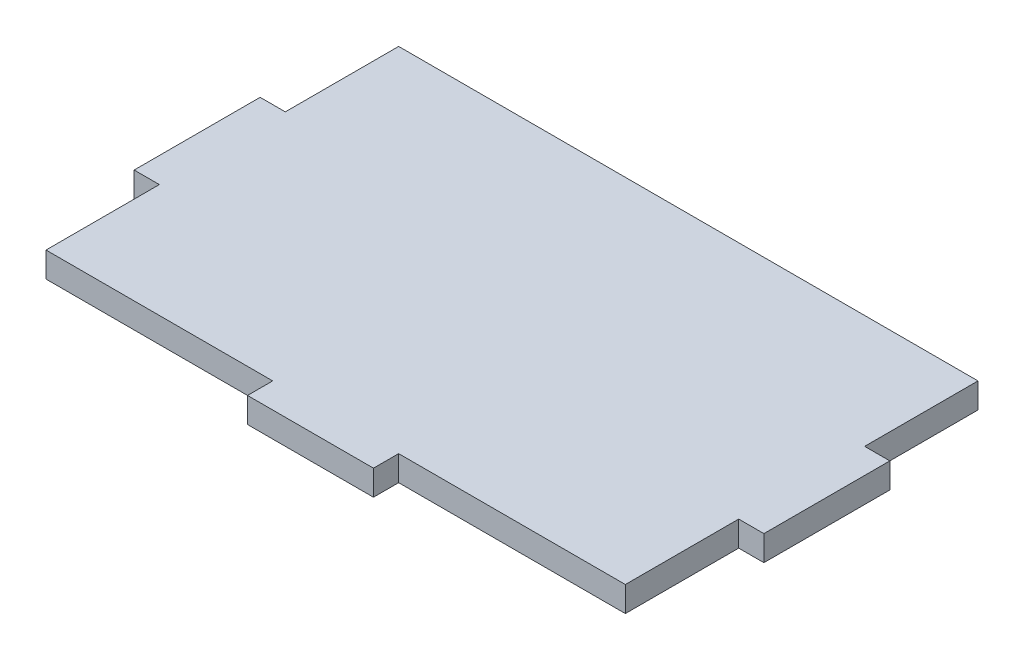
ISO-10303-21;
HEADER;
FILE_DESCRIPTION(('STEP AP214'),'2;1');
FILE_NAME('part.step','',(''),(''),'','','');
FILE_SCHEMA(('AUTOMOTIVE_DESIGN { 1 0 10303 214 1 1 1 1 }'));
ENDSEC;
DATA;
#1=APPLICATION_CONTEXT('core data for automotive mechanical design processes');
#2=APPLICATION_PROTOCOL_DEFINITION('international standard','automotive_design',2000,#1);
#3=PRODUCT_CONTEXT('',#1,'mechanical');
#4=PRODUCT('Part','Part','',(#3));
#5=PRODUCT_RELATED_PRODUCT_CATEGORY('part','',(#4));
#6=PRODUCT_DEFINITION_FORMATION('','',#4);
#7=PRODUCT_DEFINITION_CONTEXT('part definition',#1,'design');
#8=PRODUCT_DEFINITION('design','',#6,#7);
#9=PRODUCT_DEFINITION_SHAPE('','',#8);
#10=(LENGTH_UNIT() NAMED_UNIT(*) SI_UNIT(.MILLI.,.METRE.));
#11=(NAMED_UNIT(*) PLANE_ANGLE_UNIT() SI_UNIT($,.RADIAN.));
#12=(NAMED_UNIT(*) SI_UNIT($,.STERADIAN.) SOLID_ANGLE_UNIT());
#13=UNCERTAINTY_MEASURE_WITH_UNIT(LENGTH_MEASURE(1.E-05),#10,'distance_accuracy_value','');
#14=(GEOMETRIC_REPRESENTATION_CONTEXT(3) GLOBAL_UNCERTAINTY_ASSIGNED_CONTEXT((#13)) GLOBAL_UNIT_ASSIGNED_CONTEXT((#10,
#11,#12)) REPRESENTATION_CONTEXT('',''));
#15=CARTESIAN_POINT('',(0.,0.,0.));
#16=DIRECTION('',(0.,0.,1.));
#17=DIRECTION('',(1.,0.,0.));
#18=AXIS2_PLACEMENT_3D('',#15,#16,#17);
#19=CARTESIAN_POINT('',(0.,4.,0.));
#20=DIRECTION('',(0.,0.,-1.));
#21=DIRECTION('',(-1.,0.,0.));
#22=AXIS2_PLACEMENT_3D('',#19,#20,#21);
#23=PLANE('',#22);
#24=DIRECTION('',(1.,0.,0.));
#25=VECTOR('',#24,1.);
#26=CARTESIAN_POINT('',(0.,0.,0.));
#27=LINE('',#26,#25);
#28=CARTESIAN_POINT('',(0.,0.,0.));
#29=VERTEX_POINT('',#28);
#30=CARTESIAN_POINT('',(36.,0.,0.));
#31=VERTEX_POINT('',#30);
#32=EDGE_CURVE('E185',#29,#31,#27,.T.);
#33=ORIENTED_EDGE('',*,*,#32,.T.);
#34=DIRECTION('',(0.,-1.,0.));
#35=VECTOR('',#34,1.);
#36=CARTESIAN_POINT('',(36.,4.,0.));
#37=LINE('',#36,#35);
#38=CARTESIAN_POINT('',(36.,4.,0.));
#39=VERTEX_POINT('',#38);
#40=EDGE_CURVE('E11',#39,#31,#37,.T.);
#41=ORIENTED_EDGE('',*,*,#40,.F.);
#42=DIRECTION('',(1.,0.,0.));
#43=VECTOR('',#42,1.);
#44=CARTESIAN_POINT('',(0.,4.,0.));
#45=LINE('',#44,#43);
#46=CARTESIAN_POINT('',(0.,4.,0.));
#47=VERTEX_POINT('',#46);
#48=EDGE_CURVE('E266',#47,#39,#45,.T.);
#49=ORIENTED_EDGE('',*,*,#48,.F.);
#50=DIRECTION('',(0.,-1.,0.));
#51=VECTOR('',#50,1.);
#52=CARTESIAN_POINT('',(0.,4.,0.));
#53=LINE('',#52,#51);
#54=EDGE_CURVE('E54',#47,#29,#53,.T.);
#55=ORIENTED_EDGE('',*,*,#54,.T.);
#56=EDGE_LOOP('',(#33,#41,#49,#55));
#57=FACE_BOUND('',#56,.T.);
#58=ADVANCED_FACE('F37',(#57),#23,.F.);
#59=CARTESIAN_POINT('',(36.,4.,0.));
#60=DIRECTION('',(1.,0.,0.));
#61=DIRECTION('',(0.,0.,-1.));
#62=AXIS2_PLACEMENT_3D('',#59,#60,#61);
#63=PLANE('',#62);
#64=DIRECTION('',(0.,0.,1.));
#65=VECTOR('',#64,1.);
#66=CARTESIAN_POINT('',(36.,0.,0.));
#67=LINE('',#66,#65);
#68=CARTESIAN_POINT('',(36.,0.,4.));
#69=VERTEX_POINT('',#68);
#70=EDGE_CURVE('E187',#31,#69,#67,.T.);
#71=ORIENTED_EDGE('',*,*,#70,.T.);
#72=DIRECTION('',(0.,-1.,0.));
#73=VECTOR('',#72,1.);
#74=CARTESIAN_POINT('',(36.,4.,4.));
#75=LINE('',#74,#73);
#76=CARTESIAN_POINT('',(36.,4.,4.));
#77=VERTEX_POINT('',#76);
#78=EDGE_CURVE('E46',#77,#69,#75,.T.);
#79=ORIENTED_EDGE('',*,*,#78,.F.);
#80=DIRECTION('',(0.,0.,1.));
#81=VECTOR('',#80,1.);
#82=CARTESIAN_POINT('',(36.,4.,0.));
#83=LINE('',#82,#81);
#84=EDGE_CURVE('E116',#39,#77,#83,.T.);
#85=ORIENTED_EDGE('',*,*,#84,.F.);
#86=ORIENTED_EDGE('',*,*,#40,.T.);
#87=EDGE_LOOP('',(#71,#79,#85,#86));
#88=FACE_BOUND('',#87,.T.);
#89=ADVANCED_FACE('F39',(#88),#63,.F.);
#90=CARTESIAN_POINT('',(0.,4.,4.));
#91=DIRECTION('',(0.,0.,1.));
#92=DIRECTION('',(1.,0.,0.));
#93=AXIS2_PLACEMENT_3D('',#90,#91,#92);
#94=PLANE('',#93);
#95=DIRECTION('',(-1.,0.,0.));
#96=VECTOR('',#95,1.);
#97=CARTESIAN_POINT('',(0.,0.,4.));
#98=LINE('',#97,#96);
#99=CARTESIAN_POINT('',(56.,0.,4.));
#100=VERTEX_POINT('',#99);
#101=EDGE_CURVE('E191',#100,#69,#98,.T.);
#102=ORIENTED_EDGE('',*,*,#101,.F.);
#103=DIRECTION('',(0.,-1.,0.));
#104=VECTOR('',#103,1.);
#105=CARTESIAN_POINT('',(56.,4.,4.));
#106=LINE('',#105,#104);
#107=CARTESIAN_POINT('',(56.,4.,4.));
#108=VERTEX_POINT('',#107);
#109=EDGE_CURVE('E244',#108,#100,#106,.T.);
#110=ORIENTED_EDGE('',*,*,#109,.F.);
#111=DIRECTION('',(-1.,0.,0.));
#112=VECTOR('',#111,1.);
#113=CARTESIAN_POINT('',(0.,4.,4.));
#114=LINE('',#113,#112);
#115=EDGE_CURVE('E250',#108,#77,#114,.T.);
#116=ORIENTED_EDGE('',*,*,#115,.T.);
#117=ORIENTED_EDGE('',*,*,#78,.T.);
#118=EDGE_LOOP('',(#102,#110,#116,#117));
#119=FACE_BOUND('',#118,.T.);
#120=ADVANCED_FACE('F248',(#119),#94,.T.);
#121=CARTESIAN_POINT('',(56.,4.,0.));
#122=DIRECTION('',(1.,0.,0.));
#123=DIRECTION('',(0.,0.,-1.));
#124=AXIS2_PLACEMENT_3D('',#121,#122,#123);
#125=PLANE('',#124);
#126=DIRECTION('',(0.,0.,1.));
#127=VECTOR('',#126,1.);
#128=CARTESIAN_POINT('',(56.,0.,0.));
#129=LINE('',#128,#127);
#130=CARTESIAN_POINT('',(56.,0.,0.));
#131=VERTEX_POINT('',#130);
#132=EDGE_CURVE('E194',#131,#100,#129,.T.);
#133=ORIENTED_EDGE('',*,*,#132,.F.);
#134=DIRECTION('',(0.,-1.,0.));
#135=VECTOR('',#134,1.);
#136=CARTESIAN_POINT('',(56.,4.,0.));
#137=LINE('',#136,#135);
#138=CARTESIAN_POINT('',(56.,4.,0.));
#139=VERTEX_POINT('',#138);
#140=EDGE_CURVE('E242',#139,#131,#137,.T.);
#141=ORIENTED_EDGE('',*,*,#140,.F.);
#142=DIRECTION('',(0.,0.,1.));
#143=VECTOR('',#142,1.);
#144=CARTESIAN_POINT('',(56.,4.,0.));
#145=LINE('',#144,#143);
#146=EDGE_CURVE('E262',#139,#108,#145,.T.);
#147=ORIENTED_EDGE('',*,*,#146,.T.);
#148=ORIENTED_EDGE('',*,*,#109,.T.);
#149=EDGE_LOOP('',(#133,#141,#147,#148));
#150=FACE_BOUND('',#149,.T.);
#151=ADVANCED_FACE('F258',(#150),#125,.T.);
#152=CARTESIAN_POINT('',(92.,0.,0.));
#153=VERTEX_POINT('',#152);
#154=EDGE_CURVE('E188',#131,#153,#27,.T.);
#155=ORIENTED_EDGE('',*,*,#154,.T.);
#156=DIRECTION('',(0.,-1.,0.));
#157=VECTOR('',#156,1.);
#158=CARTESIAN_POINT('',(92.,4.,0.));
#159=LINE('',#158,#157);
#160=CARTESIAN_POINT('',(92.,4.,0.));
#161=VERTEX_POINT('',#160);
#162=EDGE_CURVE('E239',#161,#153,#159,.T.);
#163=ORIENTED_EDGE('',*,*,#162,.F.);
#164=EDGE_CURVE('E264',#139,#161,#45,.T.);
#165=ORIENTED_EDGE('',*,*,#164,.F.);
#166=ORIENTED_EDGE('',*,*,#140,.T.);
#167=EDGE_LOOP('',(#155,#163,#165,#166));
#168=FACE_BOUND('',#167,.T.);
#169=ADVANCED_FACE('F311',(#168),#23,.F.);
#170=CARTESIAN_POINT('',(92.,4.,0.));
#171=DIRECTION('',(-1.,0.,0.));
#172=DIRECTION('',(0.,0.,1.));
#173=AXIS2_PLACEMENT_3D('',#170,#171,#172);
#174=PLANE('',#173);
#175=DIRECTION('',(0.,0.,-1.));
#176=VECTOR('',#175,1.);
#177=CARTESIAN_POINT('',(92.,0.,0.));
#178=LINE('',#177,#176);
#179=CARTESIAN_POINT('',(92.,0.,-18.));
#180=VERTEX_POINT('',#179);
#181=EDGE_CURVE('E197',#153,#180,#178,.T.);
#182=ORIENTED_EDGE('',*,*,#181,.T.);
#183=DIRECTION('',(0.,-1.,0.));
#184=VECTOR('',#183,1.);
#185=CARTESIAN_POINT('',(92.,4.,-18.));
#186=LINE('',#185,#184);
#187=CARTESIAN_POINT('',(92.,4.,-18.));
#188=VERTEX_POINT('',#187);
#189=EDGE_CURVE('E236',#188,#180,#186,.T.);
#190=ORIENTED_EDGE('',*,*,#189,.F.);
#191=DIRECTION('',(0.,0.,-1.));
#192=VECTOR('',#191,1.);
#193=CARTESIAN_POINT('',(92.,4.,0.));
#194=LINE('',#193,#192);
#195=EDGE_CURVE('E270',#161,#188,#194,.T.);
#196=ORIENTED_EDGE('',*,*,#195,.F.);
#197=ORIENTED_EDGE('',*,*,#162,.T.);
#198=EDGE_LOOP('',(#182,#190,#196,#197));
#199=FACE_BOUND('',#198,.T.);
#200=ADVANCED_FACE('F318',(#199),#174,.F.);
#201=CARTESIAN_POINT('',(0.,4.,-18.));
#202=DIRECTION('',(0.,0.,-1.));
#203=DIRECTION('',(-1.,0.,0.));
#204=AXIS2_PLACEMENT_3D('',#201,#202,#203);
#205=PLANE('',#204);
#206=DIRECTION('',(1.,0.,0.));
#207=VECTOR('',#206,1.);
#208=CARTESIAN_POINT('',(0.,0.,-18.));
#209=LINE('',#208,#207);
#210=CARTESIAN_POINT('',(96.,0.,-18.));
#211=VERTEX_POINT('',#210);
#212=EDGE_CURVE('E199',#180,#211,#209,.T.);
#213=ORIENTED_EDGE('',*,*,#212,.T.);
#214=DIRECTION('',(0.,-1.,0.));
#215=VECTOR('',#214,1.);
#216=CARTESIAN_POINT('',(96.,4.,-18.));
#217=LINE('',#216,#215);
#218=CARTESIAN_POINT('',(96.,4.,-18.));
#219=VERTEX_POINT('',#218);
#220=EDGE_CURVE('E234',#219,#211,#217,.T.);
#221=ORIENTED_EDGE('',*,*,#220,.F.);
#222=DIRECTION('',(1.,0.,0.));
#223=VECTOR('',#222,1.);
#224=CARTESIAN_POINT('',(0.,4.,-18.));
#225=LINE('',#224,#223);
#226=EDGE_CURVE('E272',#188,#219,#225,.T.);
#227=ORIENTED_EDGE('',*,*,#226,.F.);
#228=ORIENTED_EDGE('',*,*,#189,.T.);
#229=EDGE_LOOP('',(#213,#221,#227,#228));
#230=FACE_BOUND('',#229,.T.);
#231=ADVANCED_FACE('F324',(#230),#205,.F.);
#232=CARTESIAN_POINT('',(96.,4.,0.));
#233=DIRECTION('',(1.,0.,0.));
#234=DIRECTION('',(0.,0.,-1.));
#235=AXIS2_PLACEMENT_3D('',#232,#233,#234);
#236=PLANE('',#235);
#237=DIRECTION('',(0.,0.,1.));
#238=VECTOR('',#237,1.);
#239=CARTESIAN_POINT('',(96.,0.,0.));
#240=LINE('',#239,#238);
#241=CARTESIAN_POINT('',(96.,0.,-38.));
#242=VERTEX_POINT('',#241);
#243=EDGE_CURVE('E203',#242,#211,#240,.T.);
#244=ORIENTED_EDGE('',*,*,#243,.F.);
#245=DIRECTION('',(0.,-1.,0.));
#246=VECTOR('',#245,1.);
#247=CARTESIAN_POINT('',(96.,4.,-38.));
#248=LINE('',#247,#246);
#249=CARTESIAN_POINT('',(96.,4.,-38.));
#250=VERTEX_POINT('',#249);
#251=EDGE_CURVE('E232',#250,#242,#248,.T.);
#252=ORIENTED_EDGE('',*,*,#251,.F.);
#253=DIRECTION('',(0.,0.,1.));
#254=VECTOR('',#253,1.);
#255=CARTESIAN_POINT('',(96.,4.,0.));
#256=LINE('',#255,#254);
#257=EDGE_CURVE('E275',#250,#219,#256,.T.);
#258=ORIENTED_EDGE('',*,*,#257,.T.);
#259=ORIENTED_EDGE('',*,*,#220,.T.);
#260=EDGE_LOOP('',(#244,#252,#258,#259));
#261=FACE_BOUND('',#260,.T.);
#262=ADVANCED_FACE('F445',(#261),#236,.T.);
#263=CARTESIAN_POINT('',(0.,4.,-38.));
#264=DIRECTION('',(0.,0.,-1.));
#265=DIRECTION('',(-1.,0.,0.));
#266=AXIS2_PLACEMENT_3D('',#263,#264,#265);
#267=PLANE('',#266);
#268=DIRECTION('',(1.,0.,0.));
#269=VECTOR('',#268,1.);
#270=CARTESIAN_POINT('',(0.,0.,-38.));
#271=LINE('',#270,#269);
#272=CARTESIAN_POINT('',(92.,0.,-38.));
#273=VERTEX_POINT('',#272);
#274=EDGE_CURVE('E206',#273,#242,#271,.T.);
#275=ORIENTED_EDGE('',*,*,#274,.F.);
#276=DIRECTION('',(0.,-1.,0.));
#277=VECTOR('',#276,1.);
#278=CARTESIAN_POINT('',(92.,4.,-38.));
#279=LINE('',#278,#277);
#280=CARTESIAN_POINT('',(92.,4.,-38.));
#281=VERTEX_POINT('',#280);
#282=EDGE_CURVE('E230',#281,#273,#279,.T.);
#283=ORIENTED_EDGE('',*,*,#282,.F.);
#284=DIRECTION('',(1.,0.,0.));
#285=VECTOR('',#284,1.);
#286=CARTESIAN_POINT('',(0.,4.,-38.));
#287=LINE('',#286,#285);
#288=EDGE_CURVE('E278',#281,#250,#287,.T.);
#289=ORIENTED_EDGE('',*,*,#288,.T.);
#290=ORIENTED_EDGE('',*,*,#251,.T.);
#291=EDGE_LOOP('',(#275,#283,#289,#290));
#292=FACE_BOUND('',#291,.T.);
#293=ADVANCED_FACE('F436',(#292),#267,.T.);
#294=CARTESIAN_POINT('',(92.,0.,-56.));
#295=VERTEX_POINT('',#294);
#296=EDGE_CURVE('E200',#273,#295,#178,.T.);
#297=ORIENTED_EDGE('',*,*,#296,.T.);
#298=DIRECTION('',(0.,-1.,0.));
#299=VECTOR('',#298,1.);
#300=CARTESIAN_POINT('',(92.,4.,-56.));
#301=LINE('',#300,#299);
#302=CARTESIAN_POINT('',(92.,4.,-56.));
#303=VERTEX_POINT('',#302);
#304=EDGE_CURVE('E228',#303,#295,#301,.T.);
#305=ORIENTED_EDGE('',*,*,#304,.F.);
#306=EDGE_CURVE('E273',#281,#303,#194,.T.);
#307=ORIENTED_EDGE('',*,*,#306,.F.);
#308=ORIENTED_EDGE('',*,*,#282,.T.);
#309=EDGE_LOOP('',(#297,#305,#307,#308));
#310=FACE_BOUND('',#309,.T.);
#311=ADVANCED_FACE('F327',(#310),#174,.F.);
#312=CARTESIAN_POINT('',(0.,4.,-56.));
#313=DIRECTION('',(0.,0.,-1.));
#314=DIRECTION('',(-1.,0.,0.));
#315=AXIS2_PLACEMENT_3D('',#312,#313,#314);
#316=PLANE('',#315);
#317=DIRECTION('',(1.,0.,0.));
#318=VECTOR('',#317,1.);
#319=CARTESIAN_POINT('',(0.,0.,-56.));
#320=LINE('',#319,#318);
#321=CARTESIAN_POINT('',(0.,0.,-56.));
#322=VERTEX_POINT('',#321);
#323=EDGE_CURVE('E209',#322,#295,#320,.T.);
#324=ORIENTED_EDGE('',*,*,#323,.F.);
#325=DIRECTION('',(0.,-1.,0.));
#326=VECTOR('',#325,1.);
#327=CARTESIAN_POINT('',(0.,4.,-56.));
#328=LINE('',#327,#326);
#329=CARTESIAN_POINT('',(0.,4.,-56.));
#330=VERTEX_POINT('',#329);
#331=EDGE_CURVE('E226',#330,#322,#328,.T.);
#332=ORIENTED_EDGE('',*,*,#331,.F.);
#333=DIRECTION('',(1.,0.,0.));
#334=VECTOR('',#333,1.);
#335=CARTESIAN_POINT('',(0.,4.,-56.));
#336=LINE('',#335,#334);
#337=EDGE_CURVE('E281',#330,#303,#336,.T.);
#338=ORIENTED_EDGE('',*,*,#337,.T.);
#339=ORIENTED_EDGE('',*,*,#304,.T.);
#340=EDGE_LOOP('',(#324,#332,#338,#339));
#341=FACE_BOUND('',#340,.T.);
#342=ADVANCED_FACE('F293',(#341),#316,.T.);
#343=CARTESIAN_POINT('',(0.,4.,0.));
#344=DIRECTION('',(-1.,0.,0.));
#345=DIRECTION('',(0.,0.,1.));
#346=AXIS2_PLACEMENT_3D('',#343,#344,#345);
#347=PLANE('',#346);
#348=DIRECTION('',(0.,0.,-1.));
#349=VECTOR('',#348,1.);
#350=CARTESIAN_POINT('',(0.,0.,0.));
#351=LINE('',#350,#349);
#352=CARTESIAN_POINT('',(0.,0.,-38.));
#353=VERTEX_POINT('',#352);
#354=EDGE_CURVE('E212',#353,#322,#351,.T.);
#355=ORIENTED_EDGE('',*,*,#354,.F.);
#356=DIRECTION('',(0.,-1.,0.));
#357=VECTOR('',#356,1.);
#358=CARTESIAN_POINT('',(0.,4.,-38.));
#359=LINE('',#358,#357);
#360=CARTESIAN_POINT('',(0.,4.,-38.));
#361=VERTEX_POINT('',#360);
#362=EDGE_CURVE('E224',#361,#353,#359,.T.);
#363=ORIENTED_EDGE('',*,*,#362,.F.);
#364=DIRECTION('',(0.,0.,-1.));
#365=VECTOR('',#364,1.);
#366=CARTESIAN_POINT('',(0.,4.,0.));
#367=LINE('',#366,#365);
#368=EDGE_CURVE('E182',#361,#330,#367,.T.);
#369=ORIENTED_EDGE('',*,*,#368,.T.);
#370=ORIENTED_EDGE('',*,*,#331,.T.);
#371=EDGE_LOOP('',(#355,#363,#369,#370));
#372=FACE_BOUND('',#371,.T.);
#373=ADVANCED_FACE('F286',(#372),#347,.T.);
#374=CARTESIAN_POINT('',(0.,4.,-38.));
#375=DIRECTION('',(0.,0.,1.));
#376=DIRECTION('',(1.,0.,0.));
#377=AXIS2_PLACEMENT_3D('',#374,#375,#376);
#378=PLANE('',#377);
#379=DIRECTION('',(-1.,0.,0.));
#380=VECTOR('',#379,1.);
#381=CARTESIAN_POINT('',(0.,0.,-38.));
#382=LINE('',#381,#380);
#383=CARTESIAN_POINT('',(-4.,0.,-38.));
#384=VERTEX_POINT('',#383);
#385=EDGE_CURVE('E215',#353,#384,#382,.T.);
#386=ORIENTED_EDGE('',*,*,#385,.T.);
#387=DIRECTION('',(0.,-1.,0.));
#388=VECTOR('',#387,1.);
#389=CARTESIAN_POINT('',(-4.,4.,-38.));
#390=LINE('',#389,#388);
#391=CARTESIAN_POINT('',(-4.,4.,-38.));
#392=VERTEX_POINT('',#391);
#393=EDGE_CURVE('E176',#392,#384,#390,.T.);
#394=ORIENTED_EDGE('',*,*,#393,.F.);
#395=DIRECTION('',(-1.,0.,0.));
#396=VECTOR('',#395,1.);
#397=CARTESIAN_POINT('',(0.,4.,-38.));
#398=LINE('',#397,#396);
#399=EDGE_CURVE('E164',#361,#392,#398,.T.);
#400=ORIENTED_EDGE('',*,*,#399,.F.);
#401=ORIENTED_EDGE('',*,*,#362,.T.);
#402=EDGE_LOOP('',(#386,#394,#400,#401));
#403=FACE_BOUND('',#402,.T.);
#404=ADVANCED_FACE('F298',(#403),#378,.F.);
#405=CARTESIAN_POINT('',(-3.99999999999999,4.,0.));
#406=DIRECTION('',(1.,0.,0.));
#407=DIRECTION('',(0.,0.,-1.));
#408=AXIS2_PLACEMENT_3D('',#405,#406,#407);
#409=PLANE('',#408);
#410=DIRECTION('',(0.,0.,1.));
#411=VECTOR('',#410,1.);
#412=CARTESIAN_POINT('',(-3.99999999999999,0.,0.));
#413=LINE('',#412,#411);
#414=CARTESIAN_POINT('',(-4.,0.,-18.));
#415=VERTEX_POINT('',#414);
#416=EDGE_CURVE('E173',#384,#415,#413,.T.);
#417=ORIENTED_EDGE('',*,*,#416,.T.);
#418=DIRECTION('',(0.,-1.,0.));
#419=VECTOR('',#418,1.);
#420=CARTESIAN_POINT('',(-4.,4.,-18.));
#421=LINE('',#420,#419);
#422=CARTESIAN_POINT('',(-4.,4.,-18.));
#423=VERTEX_POINT('',#422);
#424=EDGE_CURVE('E170',#423,#415,#421,.T.);
#425=ORIENTED_EDGE('',*,*,#424,.F.);
#426=DIRECTION('',(0.,0.,1.));
#427=VECTOR('',#426,1.);
#428=CARTESIAN_POINT('',(-3.99999999999999,4.,0.));
#429=LINE('',#428,#427);
#430=EDGE_CURVE('E156',#392,#423,#429,.T.);
#431=ORIENTED_EDGE('',*,*,#430,.F.);
#432=ORIENTED_EDGE('',*,*,#393,.T.);
#433=EDGE_LOOP('',(#417,#425,#431,#432));
#434=FACE_BOUND('',#433,.T.);
#435=ADVANCED_FACE('F171',(#434),#409,.F.);
#436=CARTESIAN_POINT('',(0.,4.,-18.));
#437=DIRECTION('',(0.,0.,1.));
#438=DIRECTION('',(1.,0.,0.));
#439=AXIS2_PLACEMENT_3D('',#436,#437,#438);
#440=PLANE('',#439);
#441=DIRECTION('',(-1.,0.,0.));
#442=VECTOR('',#441,1.);
#443=CARTESIAN_POINT('',(0.,0.,-18.));
#444=LINE('',#443,#442);
#445=CARTESIAN_POINT('',(0.,0.,-18.));
#446=VERTEX_POINT('',#445);
#447=EDGE_CURVE('E219',#446,#415,#444,.T.);
#448=ORIENTED_EDGE('',*,*,#447,.F.);
#449=DIRECTION('',(0.,-1.,0.));
#450=VECTOR('',#449,1.);
#451=CARTESIAN_POINT('',(0.,4.,-18.));
#452=LINE('',#451,#450);
#453=CARTESIAN_POINT('',(0.,4.,-18.));
#454=VERTEX_POINT('',#453);
#455=EDGE_CURVE('E104',#454,#446,#452,.T.);
#456=ORIENTED_EDGE('',*,*,#455,.F.);
#457=DIRECTION('',(-1.,0.,0.));
#458=VECTOR('',#457,1.);
#459=CARTESIAN_POINT('',(0.,4.,-18.));
#460=LINE('',#459,#458);
#461=EDGE_CURVE('E161',#454,#423,#460,.T.);
#462=ORIENTED_EDGE('',*,*,#461,.T.);
#463=ORIENTED_EDGE('',*,*,#424,.T.);
#464=EDGE_LOOP('',(#448,#456,#462,#463));
#465=FACE_BOUND('',#464,.T.);
#466=ADVANCED_FACE('F178',(#465),#440,.T.);
#467=EDGE_CURVE('E216',#29,#446,#351,.T.);
#468=ORIENTED_EDGE('',*,*,#467,.F.);
#469=ORIENTED_EDGE('',*,*,#54,.F.);
#470=EDGE_CURVE('E179',#47,#454,#367,.T.);
#471=ORIENTED_EDGE('',*,*,#470,.T.);
#472=ORIENTED_EDGE('',*,*,#455,.T.);
#473=EDGE_LOOP('',(#468,#469,#471,#472));
#474=FACE_BOUND('',#473,.T.);
#475=ADVANCED_FACE('F307',(#474),#347,.T.);
#476=CARTESIAN_POINT('',(0.,4.,0.));
#477=DIRECTION('',(0.,1.,0.));
#478=DIRECTION('',(0.,0.,1.));
#479=AXIS2_PLACEMENT_3D('',#476,#477,#478);
#480=PLANE('',#479);
#481=ORIENTED_EDGE('',*,*,#48,.T.);
#482=ORIENTED_EDGE('',*,*,#84,.T.);
#483=ORIENTED_EDGE('',*,*,#115,.F.);
#484=ORIENTED_EDGE('',*,*,#146,.F.);
#485=ORIENTED_EDGE('',*,*,#164,.T.);
#486=ORIENTED_EDGE('',*,*,#195,.T.);
#487=ORIENTED_EDGE('',*,*,#226,.T.);
#488=ORIENTED_EDGE('',*,*,#257,.F.);
#489=ORIENTED_EDGE('',*,*,#288,.F.);
#490=ORIENTED_EDGE('',*,*,#306,.T.);
#491=ORIENTED_EDGE('',*,*,#337,.F.);
#492=ORIENTED_EDGE('',*,*,#368,.F.);
#493=ORIENTED_EDGE('',*,*,#399,.T.);
#494=ORIENTED_EDGE('',*,*,#430,.T.);
#495=ORIENTED_EDGE('',*,*,#461,.F.);
#496=ORIENTED_EDGE('',*,*,#470,.F.);
#497=EDGE_LOOP('',(#481,#482,#483,#484,#485,#486,#487,#488,#489,#490,#491,#492,#493,#494,#495,#496));
#498=FACE_BOUND('',#497,.T.);
#499=ADVANCED_FACE('F158',(#498),#480,.T.);
#500=CARTESIAN_POINT('',(0.,0.,0.));
#501=DIRECTION('',(0.,1.,0.));
#502=DIRECTION('',(0.,0.,1.));
#503=AXIS2_PLACEMENT_3D('',#500,#501,#502);
#504=PLANE('',#503);
#505=ORIENTED_EDGE('',*,*,#32,.F.);
#506=ORIENTED_EDGE('',*,*,#467,.T.);
#507=ORIENTED_EDGE('',*,*,#447,.T.);
#508=ORIENTED_EDGE('',*,*,#416,.F.);
#509=ORIENTED_EDGE('',*,*,#385,.F.);
#510=ORIENTED_EDGE('',*,*,#354,.T.);
#511=ORIENTED_EDGE('',*,*,#323,.T.);
#512=ORIENTED_EDGE('',*,*,#296,.F.);
#513=ORIENTED_EDGE('',*,*,#274,.T.);
#514=ORIENTED_EDGE('',*,*,#243,.T.);
#515=ORIENTED_EDGE('',*,*,#212,.F.);
#516=ORIENTED_EDGE('',*,*,#181,.F.);
#517=ORIENTED_EDGE('',*,*,#154,.F.);
#518=ORIENTED_EDGE('',*,*,#132,.T.);
#519=ORIENTED_EDGE('',*,*,#101,.T.);
#520=ORIENTED_EDGE('',*,*,#70,.F.);
#521=EDGE_LOOP('',(#505,#506,#507,#508,#509,#510,#511,#512,#513,#514,#515,#516,#517,#518,#519,#520));
#522=FACE_BOUND('',#521,.T.);
#523=ADVANCED_FACE('F253',(#522),#504,.F.);
#524=CLOSED_SHELL('',(#58,#89,#120,#151,#169,#200,#231,#262,#293,#311,#342,#373,#404,#435,#466,
#475,#499,#523));
#525=MANIFOLD_SOLID_BREP('B2',#524);
#526=ADVANCED_BREP_SHAPE_REPRESENTATION('',(#18,#525),#14);
#527=SHAPE_DEFINITION_REPRESENTATION(#9,#526);
ENDSEC;
END-ISO-10303-21;
